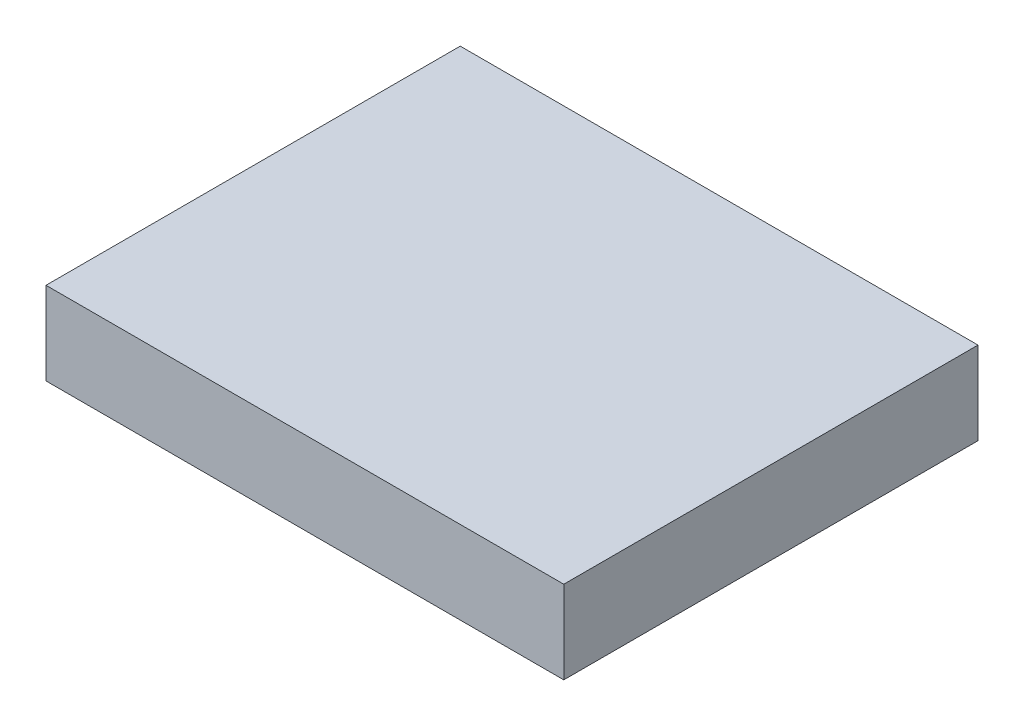
ISO-10303-21;
HEADER;
FILE_DESCRIPTION(('STEP AP214'),'2;1');
FILE_NAME('part.step','',(''),(''),'','','');
FILE_SCHEMA(('AUTOMOTIVE_DESIGN { 1 0 10303 214 1 1 1 1 }'));
ENDSEC;
DATA;
#1=APPLICATION_CONTEXT('core data for automotive mechanical design processes');
#2=APPLICATION_PROTOCOL_DEFINITION('international standard','automotive_design',2000,#1);
#3=PRODUCT_CONTEXT('',#1,'mechanical');
#4=PRODUCT('Part','Part','',(#3));
#5=PRODUCT_RELATED_PRODUCT_CATEGORY('part','',(#4));
#6=PRODUCT_DEFINITION_FORMATION('','',#4);
#7=PRODUCT_DEFINITION_CONTEXT('part definition',#1,'design');
#8=PRODUCT_DEFINITION('design','',#6,#7);
#9=PRODUCT_DEFINITION_SHAPE('','',#8);
#10=(LENGTH_UNIT() NAMED_UNIT(*) SI_UNIT(.MILLI.,.METRE.));
#11=(NAMED_UNIT(*) PLANE_ANGLE_UNIT() SI_UNIT($,.RADIAN.));
#12=(NAMED_UNIT(*) SI_UNIT($,.STERADIAN.) SOLID_ANGLE_UNIT());
#13=UNCERTAINTY_MEASURE_WITH_UNIT(LENGTH_MEASURE(1.E-05),#10,'distance_accuracy_value','');
#14=(GEOMETRIC_REPRESENTATION_CONTEXT(3) GLOBAL_UNCERTAINTY_ASSIGNED_CONTEXT((#13)) GLOBAL_UNIT_ASSIGNED_CONTEXT((#10,
#11,#12)) REPRESENTATION_CONTEXT('',''));
#15=CARTESIAN_POINT('',(0.,0.,0.));
#16=DIRECTION('',(0.,0.,1.));
#17=DIRECTION('',(1.,0.,0.));
#18=AXIS2_PLACEMENT_3D('',#15,#16,#17);
#19=CARTESIAN_POINT('',(0.,4.,0.));
#20=DIRECTION('',(1.,0.,0.));
#21=DIRECTION('',(0.,0.,-1.));
#22=AXIS2_PLACEMENT_3D('',#19,#20,#21);
#23=PLANE('',#22);
#24=DIRECTION('',(0.,0.,1.));
#25=VECTOR('',#24,1.);
#26=CARTESIAN_POINT('',(0.,0.,0.));
#27=LINE('',#26,#25);
#28=CARTESIAN_POINT('',(0.,0.,0.));
#29=VERTEX_POINT('',#28);
#30=CARTESIAN_POINT('',(0.,0.,20.));
#31=VERTEX_POINT('',#30);
#32=EDGE_CURVE('E98',#29,#31,#27,.T.);
#33=ORIENTED_EDGE('',*,*,#32,.T.);
#34=DIRECTION('',(0.,-1.,0.));
#35=VECTOR('',#34,1.);
#36=CARTESIAN_POINT('',(0.,4.,20.));
#37=LINE('',#36,#35);
#38=CARTESIAN_POINT('',(0.,4.,20.));
#39=VERTEX_POINT('',#38);
#40=EDGE_CURVE('E11',#39,#31,#37,.T.);
#41=ORIENTED_EDGE('',*,*,#40,.F.);
#42=DIRECTION('',(0.,0.,1.));
#43=VECTOR('',#42,1.);
#44=CARTESIAN_POINT('',(0.,4.,0.));
#45=LINE('',#44,#43);
#46=CARTESIAN_POINT('',(0.,4.,0.));
#47=VERTEX_POINT('',#46);
#48=EDGE_CURVE('E86',#47,#39,#45,.T.);
#49=ORIENTED_EDGE('',*,*,#48,.F.);
#50=DIRECTION('',(0.,-1.,0.));
#51=VECTOR('',#50,1.);
#52=CARTESIAN_POINT('',(0.,4.,0.));
#53=LINE('',#52,#51);
#54=EDGE_CURVE('E94',#47,#29,#53,.T.);
#55=ORIENTED_EDGE('',*,*,#54,.T.);
#56=EDGE_LOOP('',(#33,#41,#49,#55));
#57=FACE_BOUND('',#56,.T.);
#58=ADVANCED_FACE('F35',(#57),#23,.F.);
#59=CARTESIAN_POINT('',(0.,4.,20.));
#60=DIRECTION('',(0.,0.,-1.));
#61=DIRECTION('',(-1.,0.,0.));
#62=AXIS2_PLACEMENT_3D('',#59,#60,#61);
#63=PLANE('',#62);
#64=DIRECTION('',(1.,0.,0.));
#65=VECTOR('',#64,1.);
#66=CARTESIAN_POINT('',(0.,0.,20.));
#67=LINE('',#66,#65);
#68=CARTESIAN_POINT('',(25.,0.,20.));
#69=VERTEX_POINT('',#68);
#70=EDGE_CURVE('E90',#31,#69,#67,.T.);
#71=ORIENTED_EDGE('',*,*,#70,.T.);
#72=DIRECTION('',(0.,-1.,0.));
#73=VECTOR('',#72,1.);
#74=CARTESIAN_POINT('',(25.,4.,20.));
#75=LINE('',#74,#73);
#76=CARTESIAN_POINT('',(25.,4.,20.));
#77=VERTEX_POINT('',#76);
#78=EDGE_CURVE('E43',#77,#69,#75,.T.);
#79=ORIENTED_EDGE('',*,*,#78,.F.);
#80=DIRECTION('',(1.,0.,0.));
#81=VECTOR('',#80,1.);
#82=CARTESIAN_POINT('',(0.,4.,20.));
#83=LINE('',#82,#81);
#84=EDGE_CURVE('E81',#39,#77,#83,.T.);
#85=ORIENTED_EDGE('',*,*,#84,.F.);
#86=ORIENTED_EDGE('',*,*,#40,.T.);
#87=EDGE_LOOP('',(#71,#79,#85,#86));
#88=FACE_BOUND('',#87,.T.);
#89=ADVANCED_FACE('F89',(#88),#63,.F.);
#90=CARTESIAN_POINT('',(25.,4.,0.));
#91=DIRECTION('',(-1.,0.,0.));
#92=DIRECTION('',(0.,0.,1.));
#93=AXIS2_PLACEMENT_3D('',#90,#91,#92);
#94=PLANE('',#93);
#95=DIRECTION('',(0.,0.,-1.));
#96=VECTOR('',#95,1.);
#97=CARTESIAN_POINT('',(25.,0.,0.));
#98=LINE('',#97,#96);
#99=CARTESIAN_POINT('',(25.,0.,0.));
#100=VERTEX_POINT('',#99);
#101=EDGE_CURVE('E68',#69,#100,#98,.T.);
#102=ORIENTED_EDGE('',*,*,#101,.T.);
#103=DIRECTION('',(0.,-1.,0.));
#104=VECTOR('',#103,1.);
#105=CARTESIAN_POINT('',(25.,4.,0.));
#106=LINE('',#105,#104);
#107=CARTESIAN_POINT('',(25.,4.,0.));
#108=VERTEX_POINT('',#107);
#109=EDGE_CURVE('E91',#108,#100,#106,.T.);
#110=ORIENTED_EDGE('',*,*,#109,.F.);
#111=DIRECTION('',(0.,0.,-1.));
#112=VECTOR('',#111,1.);
#113=CARTESIAN_POINT('',(25.,4.,0.));
#114=LINE('',#113,#112);
#115=EDGE_CURVE('E84',#77,#108,#114,.T.);
#116=ORIENTED_EDGE('',*,*,#115,.F.);
#117=ORIENTED_EDGE('',*,*,#78,.T.);
#118=EDGE_LOOP('',(#102,#110,#116,#117));
#119=FACE_BOUND('',#118,.T.);
#120=ADVANCED_FACE('F92',(#119),#94,.F.);
#121=CARTESIAN_POINT('',(0.,4.,0.));
#122=DIRECTION('',(0.,0.,1.));
#123=DIRECTION('',(1.,0.,0.));
#124=AXIS2_PLACEMENT_3D('',#121,#122,#123);
#125=PLANE('',#124);
#126=DIRECTION('',(-1.,0.,0.));
#127=VECTOR('',#126,1.);
#128=CARTESIAN_POINT('',(0.,0.,0.));
#129=LINE('',#128,#127);
#130=EDGE_CURVE('E74',#100,#29,#129,.T.);
#131=ORIENTED_EDGE('',*,*,#130,.T.);
#132=ORIENTED_EDGE('',*,*,#54,.F.);
#133=DIRECTION('',(-1.,0.,0.));
#134=VECTOR('',#133,1.);
#135=CARTESIAN_POINT('',(0.,4.,0.));
#136=LINE('',#135,#134);
#137=EDGE_CURVE('E51',#108,#47,#136,.T.);
#138=ORIENTED_EDGE('',*,*,#137,.F.);
#139=ORIENTED_EDGE('',*,*,#109,.T.);
#140=EDGE_LOOP('',(#131,#132,#138,#139));
#141=FACE_BOUND('',#140,.T.);
#142=ADVANCED_FACE('F105',(#141),#125,.F.);
#143=CARTESIAN_POINT('',(0.,4.,0.));
#144=DIRECTION('',(0.,1.,0.));
#145=DIRECTION('',(0.,0.,1.));
#146=AXIS2_PLACEMENT_3D('',#143,#144,#145);
#147=PLANE('',#146);
#148=ORIENTED_EDGE('',*,*,#48,.T.);
#149=ORIENTED_EDGE('',*,*,#84,.T.);
#150=ORIENTED_EDGE('',*,*,#115,.T.);
#151=ORIENTED_EDGE('',*,*,#137,.T.);
#152=EDGE_LOOP('',(#148,#149,#150,#151));
#153=FACE_BOUND('',#152,.T.);
#154=ADVANCED_FACE('F82',(#153),#147,.T.);
#155=CARTESIAN_POINT('',(0.,0.,0.));
#156=DIRECTION('',(0.,1.,0.));
#157=DIRECTION('',(0.,0.,1.));
#158=AXIS2_PLACEMENT_3D('',#155,#156,#157);
#159=PLANE('',#158);
#160=ORIENTED_EDGE('',*,*,#32,.F.);
#161=ORIENTED_EDGE('',*,*,#130,.F.);
#162=ORIENTED_EDGE('',*,*,#101,.F.);
#163=ORIENTED_EDGE('',*,*,#70,.F.);
#164=EDGE_LOOP('',(#160,#161,#162,#163));
#165=FACE_BOUND('',#164,.T.);
#166=ADVANCED_FACE('F108',(#165),#159,.F.);
#167=CLOSED_SHELL('',(#58,#89,#120,#142,#154,#166));
#168=MANIFOLD_SOLID_BREP('B2',#167);
#169=ADVANCED_BREP_SHAPE_REPRESENTATION('',(#18,#168),#14);
#170=SHAPE_DEFINITION_REPRESENTATION(#9,#169);
ENDSEC;
END-ISO-10303-21;
